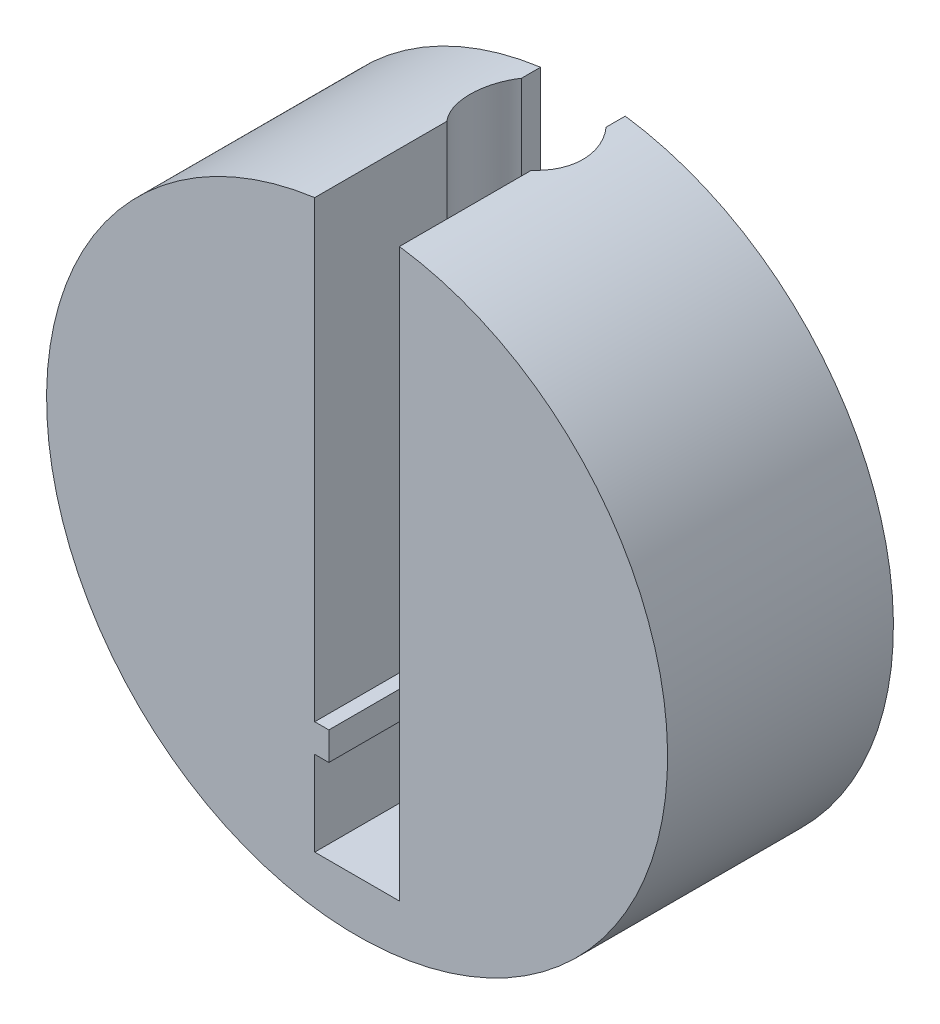
ISO-10303-21;
HEADER;
FILE_DESCRIPTION(('STEP AP214'),'2;1');
FILE_NAME('part.step','',(''),(''),'','','');
FILE_SCHEMA(('AUTOMOTIVE_DESIGN { 1 0 10303 214 1 1 1 1 }'));
ENDSEC;
DATA;
#1=APPLICATION_CONTEXT('core data for automotive mechanical design processes');
#2=APPLICATION_PROTOCOL_DEFINITION('international standard','automotive_design',2000,#1);
#3=PRODUCT_CONTEXT('',#1,'mechanical');
#4=PRODUCT('Part','Part','',(#3));
#5=PRODUCT_RELATED_PRODUCT_CATEGORY('part','',(#4));
#6=PRODUCT_DEFINITION_FORMATION('','',#4);
#7=PRODUCT_DEFINITION_CONTEXT('part definition',#1,'design');
#8=PRODUCT_DEFINITION('design','',#6,#7);
#9=PRODUCT_DEFINITION_SHAPE('','',#8);
#10=(LENGTH_UNIT() NAMED_UNIT(*) SI_UNIT(.MILLI.,.METRE.));
#11=(NAMED_UNIT(*) PLANE_ANGLE_UNIT() SI_UNIT($,.RADIAN.));
#12=(NAMED_UNIT(*) SI_UNIT($,.STERADIAN.) SOLID_ANGLE_UNIT());
#13=UNCERTAINTY_MEASURE_WITH_UNIT(LENGTH_MEASURE(1.E-05),#10,'distance_accuracy_value','');
#14=(GEOMETRIC_REPRESENTATION_CONTEXT(3) GLOBAL_UNCERTAINTY_ASSIGNED_CONTEXT((#13)) GLOBAL_UNIT_ASSIGNED_CONTEXT((#10,
#11,#12)) REPRESENTATION_CONTEXT('',''));
#15=CARTESIAN_POINT('',(0.,0.,0.));
#16=DIRECTION('',(0.,0.,1.));
#17=DIRECTION('',(1.,0.,0.));
#18=AXIS2_PLACEMENT_3D('',#15,#16,#17);
#19=CARTESIAN_POINT('',(0.,0.,0.));
#20=DIRECTION('',(0.,0.,1.));
#21=DIRECTION('',(1.,0.,0.));
#22=AXIS2_PLACEMENT_3D('',#19,#20,#21);
#23=PLANE('',#22);
#24=DIRECTION('',(0.,-1.,0.));
#25=VECTOR('',#24,1.);
#26=CARTESIAN_POINT('',(-6.,0.,0.));
#27=LINE('',#26,#25);
#28=CARTESIAN_POINT('',(-6.,1.5,0.));
#29=VERTEX_POINT('',#28);
#30=CARTESIAN_POINT('',(-6.,-1.5,0.));
#31=VERTEX_POINT('',#30);
#32=EDGE_CURVE('E72',#29,#31,#27,.T.);
#33=ORIENTED_EDGE('',*,*,#32,.T.);
#34=DIRECTION('',(-1.,0.,0.));
#35=VECTOR('',#34,1.);
#36=CARTESIAN_POINT('',(0.,-1.5,0.));
#37=LINE('',#36,#35);
#38=CARTESIAN_POINT('',(-4.,-1.5,0.));
#39=VERTEX_POINT('',#38);
#40=EDGE_CURVE('E242',#39,#31,#37,.T.);
#41=ORIENTED_EDGE('',*,*,#40,.F.);
#42=DIRECTION('',(0.,-1.,0.));
#43=VECTOR('',#42,1.);
#44=CARTESIAN_POINT('',(-4.,0.,0.));
#45=LINE('',#44,#43);
#46=CARTESIAN_POINT('',(-4.,1.5,0.));
#47=VERTEX_POINT('',#46);
#48=EDGE_CURVE('E260',#47,#39,#45,.T.);
#49=ORIENTED_EDGE('',*,*,#48,.F.);
#50=DIRECTION('',(-1.,0.,0.));
#51=VECTOR('',#50,1.);
#52=CARTESIAN_POINT('',(0.,1.5,0.));
#53=LINE('',#52,#51);
#54=EDGE_CURVE('E256',#47,#29,#53,.T.);
#55=ORIENTED_EDGE('',*,*,#54,.T.);
#56=EDGE_LOOP('',(#33,#41,#49,#55));
#57=FACE_BOUND('',#56,.T.);
#58=CARTESIAN_POINT('',(0.,0.,0.));
#59=DIRECTION('',(0.,0.,1.));
#60=DIRECTION('',(1.,0.,0.));
#61=AXIS2_PLACEMENT_3D('',#58,#59,#60);
#62=CIRCLE('',#61,11.);
#63=CARTESIAN_POINT('',(-1.5,10.8972473588517,0.));
#64=VERTEX_POINT('',#63);
#65=CARTESIAN_POINT('',(1.5,10.8972473588517,0.));
#66=VERTEX_POINT('',#65);
#67=EDGE_CURVE('E319',#64,#66,#62,.T.);
#68=ORIENTED_EDGE('',*,*,#67,.F.);
#69=DIRECTION('',(0.,-1.,0.));
#70=VECTOR('',#69,1.);
#71=CARTESIAN_POINT('',(-1.5,0.,0.));
#72=LINE('',#71,#70);
#73=CARTESIAN_POINT('',(-1.5,-5.18334617360803,0.));
#74=VERTEX_POINT('',#73);
#75=EDGE_CURVE('E324',#64,#74,#72,.T.);
#76=ORIENTED_EDGE('',*,*,#75,.T.);
#77=DIRECTION('',(-1.,0.,0.));
#78=VECTOR('',#77,1.);
#79=CARTESIAN_POINT('',(0.,-5.18334617360803,0.));
#80=LINE('',#79,#78);
#81=CARTESIAN_POINT('',(-1.,-5.18334617360803,0.));
#82=VERTEX_POINT('',#81);
#83=EDGE_CURVE('E374',#82,#74,#80,.T.);
#84=ORIENTED_EDGE('',*,*,#83,.F.);
#85=DIRECTION('',(0.,-1.,0.));
#86=VECTOR('',#85,1.);
#87=CARTESIAN_POINT('',(-1.,0.,0.));
#88=LINE('',#87,#86);
#89=CARTESIAN_POINT('',(-1.,-6.18334617360803,0.));
#90=VERTEX_POINT('',#89);
#91=EDGE_CURVE('E370',#82,#90,#88,.T.);
#92=ORIENTED_EDGE('',*,*,#91,.T.);
#93=DIRECTION('',(-1.,0.,0.));
#94=VECTOR('',#93,1.);
#95=CARTESIAN_POINT('',(0.,-6.18334617360803,0.));
#96=LINE('',#95,#94);
#97=CARTESIAN_POINT('',(-1.5,-6.18334617360803,0.));
#98=VERTEX_POINT('',#97);
#99=EDGE_CURVE('E366',#90,#98,#96,.T.);
#100=ORIENTED_EDGE('',*,*,#99,.T.);
#101=DIRECTION('',(0.,-1.,0.));
#102=VECTOR('',#101,1.);
#103=CARTESIAN_POINT('',(-1.5,0.,0.));
#104=LINE('',#103,#102);
#105=CARTESIAN_POINT('',(-1.5,-9.18334617360804,0.));
#106=VERTEX_POINT('',#105);
#107=EDGE_CURVE('E362',#98,#106,#104,.T.);
#108=ORIENTED_EDGE('',*,*,#107,.T.);
#109=DIRECTION('',(-1.,0.,0.));
#110=VECTOR('',#109,1.);
#111=CARTESIAN_POINT('',(0.,-9.18334617360804,0.));
#112=LINE('',#111,#110);
#113=CARTESIAN_POINT('',(1.5,-9.18334617360804,0.));
#114=VERTEX_POINT('',#113);
#115=EDGE_CURVE('E358',#114,#106,#112,.T.);
#116=ORIENTED_EDGE('',*,*,#115,.F.);
#117=DIRECTION('',(0.,1.,0.));
#118=VECTOR('',#117,1.);
#119=CARTESIAN_POINT('',(1.5,0.,0.));
#120=LINE('',#119,#118);
#121=EDGE_CURVE('E354',#114,#66,#120,.T.);
#122=ORIENTED_EDGE('',*,*,#121,.T.);
#123=EDGE_LOOP('',(#68,#76,#84,#92,#100,#108,#116,#122));
#124=FACE_BOUND('',#123,.T.);
#125=DIRECTION('',(0.,-1.,0.));
#126=VECTOR('',#125,1.);
#127=CARTESIAN_POINT('',(4.,0.,0.));
#128=LINE('',#127,#126);
#129=CARTESIAN_POINT('',(4.,1.5,0.));
#130=VERTEX_POINT('',#129);
#131=CARTESIAN_POINT('',(4.,-1.5,0.));
#132=VERTEX_POINT('',#131);
#133=EDGE_CURVE('E64',#130,#132,#128,.T.);
#134=ORIENTED_EDGE('',*,*,#133,.T.);
#135=DIRECTION('',(-1.,0.,0.));
#136=VECTOR('',#135,1.);
#137=CARTESIAN_POINT('',(0.,-1.5,0.));
#138=LINE('',#137,#136);
#139=CARTESIAN_POINT('',(6.,-1.5,0.));
#140=VERTEX_POINT('',#139);
#141=EDGE_CURVE('E209',#140,#132,#138,.T.);
#142=ORIENTED_EDGE('',*,*,#141,.F.);
#143=DIRECTION('',(0.,-1.,0.));
#144=VECTOR('',#143,1.);
#145=CARTESIAN_POINT('',(6.,0.,0.));
#146=LINE('',#145,#144);
#147=CARTESIAN_POINT('',(6.,1.5,0.));
#148=VERTEX_POINT('',#147);
#149=EDGE_CURVE('E213',#148,#140,#146,.T.);
#150=ORIENTED_EDGE('',*,*,#149,.F.);
#151=DIRECTION('',(-1.,0.,0.));
#152=VECTOR('',#151,1.);
#153=CARTESIAN_POINT('',(0.,1.5,0.));
#154=LINE('',#153,#152);
#155=EDGE_CURVE('E222',#148,#130,#154,.T.);
#156=ORIENTED_EDGE('',*,*,#155,.T.);
#157=EDGE_LOOP('',(#134,#142,#150,#156));
#158=FACE_BOUND('',#157,.T.);
#159=ADVANCED_FACE('F47',(#57,#124,#158),#23,.F.);
#160=CARTESIAN_POINT('',(-1.5,0.,8.));
#161=DIRECTION('',(1.,0.,0.));
#162=DIRECTION('',(0.,1.,0.));
#163=AXIS2_PLACEMENT_3D('',#160,#161,#162);
#164=PLANE('',#163);
#165=DIRECTION('',(0.,1.,0.));
#166=VECTOR('',#165,1.);
#167=CARTESIAN_POINT('',(-1.5,-10.8402004231004,0.677124344467703));
#168=LINE('',#167,#166);
#169=CARTESIAN_POINT('',(-1.5,-5.18334617360803,0.677124344467703));
#170=VERTEX_POINT('',#169);
#171=CARTESIAN_POINT('',(-1.5,10.8972473588517,0.677124344467706));
#172=VERTEX_POINT('',#171);
#173=EDGE_CURVE('E11',#170,#172,#168,.T.);
#174=ORIENTED_EDGE('',*,*,#173,.F.);
#175=DIRECTION('',(0.,0.,-1.));
#176=VECTOR('',#175,1.);
#177=CARTESIAN_POINT('',(-1.5,-5.18334617360803,8.));
#178=LINE('',#177,#176);
#179=EDGE_CURVE('E385',#170,#74,#178,.T.);
#180=ORIENTED_EDGE('',*,*,#179,.T.);
#181=ORIENTED_EDGE('',*,*,#75,.F.);
#182=DIRECTION('',(0.,0.,-1.));
#183=VECTOR('',#182,1.);
#184=CARTESIAN_POINT('',(-1.5,10.8972473588517,8.));
#185=LINE('',#184,#183);
#186=EDGE_CURVE('E350',#172,#64,#185,.T.);
#187=ORIENTED_EDGE('',*,*,#186,.F.);
#188=EDGE_LOOP('',(#174,#180,#181,#187));
#189=FACE_BOUND('',#188,.T.);
#190=ADVANCED_FACE('F458',(#189),#164,.T.);
#191=CARTESIAN_POINT('',(0.,0.,8.));
#192=DIRECTION('',(0.,0.,-1.));
#193=DIRECTION('',(-1.,0.,0.));
#194=AXIS2_PLACEMENT_3D('',#191,#192,#193);
#195=CYLINDRICAL_SURFACE('',#194,11.);
#196=CARTESIAN_POINT('',(-1.5,10.8972473588517,8.));
#197=VERTEX_POINT('',#196);
#198=CARTESIAN_POINT('',(-1.5,10.8972473588517,3.32287565553229));
#199=VERTEX_POINT('',#198);
#200=EDGE_CURVE('E381',#197,#199,#185,.T.);
#201=ORIENTED_EDGE('',*,*,#200,.T.);
#202=CARTESIAN_POINT('',(-1.5,10.8972473588517,3.3228756555323));
#203=CARTESIAN_POINT('',(-1.53701861772254,10.8921514934435,3.28089896762534));
#204=CARTESIAN_POINT('',(-1.57226143876146,10.8871084820412,3.23738483089129));
#205=CARTESIAN_POINT('',(-1.63899046345247,10.8772628901011,3.14753890388644));
#206=CARTESIAN_POINT('',(-1.67047658487105,10.8724603148279,3.10120705196982));
#207=CARTESIAN_POINT('',(-1.75893301637365,10.8586245894512,2.95846567358484));
#208=CARTESIAN_POINT('',(-1.80997371628999,10.8501530721462,2.85822820624215));
#209=CARTESIAN_POINT('',(-1.89461458915759,10.8356954359207,2.6504220260708));
#210=CARTESIAN_POINT('',(-1.92819956916029,10.8297114830073,2.54284701866229));
#211=CARTESIAN_POINT('',(-1.97685370507122,10.8209365192575,2.3235010289637));
#212=CARTESIAN_POINT('',(-1.99193292737687,10.8181437725887,2.21173236198941));
#213=CARTESIAN_POINT('',(-2.00305435376004,10.8160901313085,1.98846267784748));
#214=CARTESIAN_POINT('',(-1.99930453179108,10.8167906516413,1.87697228643442));
#215=CARTESIAN_POINT('',(-1.97335776979043,10.8215538837663,1.65617202223558));
#216=CARTESIAN_POINT('',(-1.95115150195586,10.8256182956495,1.54686328065653));
#217=CARTESIAN_POINT('',(-1.88908342173475,10.8366206418772,1.33394246233666));
#218=CARTESIAN_POINT('',(-1.84927827241537,10.8435493494421,1.23031329301812));
#219=CARTESIAN_POINT('',(-1.75320852353389,10.8594939611773,1.03127105955871));
#220=CARTESIAN_POINT('',(-1.69696770265243,10.8685068461124,0.935846381723813));
#221=CARTESIAN_POINT('',(-1.61265722978756,10.8811660153275,0.816516494758388));
#222=CARTESIAN_POINT('',(-1.59115461356048,10.88433426118,0.787762956575687));
#223=CARTESIAN_POINT('',(-1.54667580691712,10.890743701024,0.73150725794301));
#224=CARTESIAN_POINT('',(-1.52370217281535,10.8939847624375,0.704003061383881));
#225=CARTESIAN_POINT('',(-1.50000000000003,10.8972473588517,0.677124344467681));
#226=B_SPLINE_CURVE_WITH_KNOTS('',3,(#202,#203,#204,#205,#206,#207,#208,#209,#210,#211,#212,
#213,#214,#215,#216,#217,#218,#219,#220,#221,#222,#223,#224,#225),.UNSPECIFIED.,.F.,.F.,(4,2,2,
2,2,2,2,2,2,2,2,4),(0.,0.168497016897195,0.336997721489503,0.673673527830665,1.01064187830271,
1.34742685001015,1.68050014092636,2.01374186798522,2.34591838366978,2.67761667475394,
2.78571169251968,2.8936237109044),.UNSPECIFIED.);
#227=EDGE_CURVE('E281',#199,#172,#226,.T.);
#228=ORIENTED_EDGE('',*,*,#227,.T.);
#229=ORIENTED_EDGE('',*,*,#186,.T.);
#230=ORIENTED_EDGE('',*,*,#67,.T.);
#231=DIRECTION('',(0.,0.,-1.));
#232=VECTOR('',#231,1.);
#233=CARTESIAN_POINT('',(1.5,10.8972473588517,8.));
#234=LINE('',#233,#232);
#235=CARTESIAN_POINT('',(1.5,10.8972473588517,0.677124344467706));
#236=VERTEX_POINT('',#235);
#237=EDGE_CURVE('E405',#236,#66,#234,.T.);
#238=ORIENTED_EDGE('',*,*,#237,.F.);
#239=CARTESIAN_POINT('',(1.5,10.8972473588517,0.677124344467707));
#240=CARTESIAN_POINT('',(1.53701861772255,10.8921514934435,0.719101032374665));
#241=CARTESIAN_POINT('',(1.57226143876146,10.8871084820412,0.762615169108712));
#242=CARTESIAN_POINT('',(1.63899046345248,10.8772628901011,0.852461096113568));
#243=CARTESIAN_POINT('',(1.67047658487106,10.8724603148279,0.898792948030188));
#244=CARTESIAN_POINT('',(1.75893301637365,10.8586245894512,1.04153432641517));
#245=CARTESIAN_POINT('',(1.80997371628999,10.8501530721462,1.14177179375786));
#246=CARTESIAN_POINT('',(1.89461458915759,10.8356954359207,1.3495779739292));
#247=CARTESIAN_POINT('',(1.92819956916029,10.8297114830073,1.45715298133772));
#248=CARTESIAN_POINT('',(1.97685370507122,10.8209365192575,1.67649897103631));
#249=CARTESIAN_POINT('',(1.99193292737688,10.8181437725887,1.7882676380106));
#250=CARTESIAN_POINT('',(2.00305435376004,10.8160901313085,2.01153732215253));
#251=CARTESIAN_POINT('',(1.99930453179108,10.8167906516413,2.12302771356559));
#252=CARTESIAN_POINT('',(1.97335776979043,10.8215538837663,2.34382797776443));
#253=CARTESIAN_POINT('',(1.95115150195586,10.8256182956495,2.45313671934347));
#254=CARTESIAN_POINT('',(1.88908342173475,10.8366206418772,2.66605753766334));
#255=CARTESIAN_POINT('',(1.84927827241537,10.8435493494421,2.76968670698189));
#256=CARTESIAN_POINT('',(1.75320852353388,10.8594939611773,2.96872894044129));
#257=CARTESIAN_POINT('',(1.69696770265243,10.8685068461124,3.06415361827619));
#258=CARTESIAN_POINT('',(1.61265722978756,10.8811660153275,3.18348350524162));
#259=CARTESIAN_POINT('',(1.59115461356048,10.88433426118,3.21223704342432));
#260=CARTESIAN_POINT('',(1.54667580691712,10.890743701024,3.26849274205699));
#261=CARTESIAN_POINT('',(1.52370217281535,10.8939847624375,3.29599693861612));
#262=CARTESIAN_POINT('',(1.50000000000003,10.8972473588517,3.32287565553231));
#263=B_SPLINE_CURVE_WITH_KNOTS('',3,(#239,#240,#241,#242,#243,#244,#245,#246,#247,#248,#249,
#250,#251,#252,#253,#254,#255,#256,#257,#258,#259,#260,#261,#262),.UNSPECIFIED.,.F.,.F.,(4,2,2,
2,2,2,2,2,2,2,2,4),(0.,0.168497016897195,0.336997721489503,0.673673527830665,1.01064187830271,
1.34742685001015,1.68050014092637,2.01374186798522,2.34591838366978,2.67761667475395,
2.78571169251968,2.89362371090439),.UNSPECIFIED.);
#264=CARTESIAN_POINT('',(1.5,10.8972473588517,3.32287565553229));
#265=VERTEX_POINT('',#264);
#266=EDGE_CURVE('E305',#236,#265,#263,.T.);
#267=ORIENTED_EDGE('',*,*,#266,.T.);
#268=CARTESIAN_POINT('',(1.5,10.8972473588517,8.));
#269=VERTEX_POINT('',#268);
#270=EDGE_CURVE('E406',#269,#265,#234,.T.);
#271=ORIENTED_EDGE('',*,*,#270,.F.);
#272=CARTESIAN_POINT('',(0.,0.,8.));
#273=DIRECTION('',(0.,0.,1.));
#274=DIRECTION('',(1.,0.,0.));
#275=AXIS2_PLACEMENT_3D('',#272,#273,#274);
#276=CIRCLE('',#275,11.);
#277=EDGE_CURVE('E320',#197,#269,#276,.T.);
#278=ORIENTED_EDGE('',*,*,#277,.F.);
#279=EDGE_LOOP('',(#201,#228,#229,#230,#238,#267,#271,#278));
#280=FACE_BOUND('',#279,.T.);
#281=ADVANCED_FACE('F49',(#280),#195,.T.);
#282=CARTESIAN_POINT('',(1.5,0.,8.));
#283=DIRECTION('',(-1.,0.,0.));
#284=DIRECTION('',(0.,-1.,0.));
#285=AXIS2_PLACEMENT_3D('',#282,#283,#284);
#286=PLANE('',#285);
#287=DIRECTION('',(0.,1.,0.));
#288=VECTOR('',#287,1.);
#289=CARTESIAN_POINT('',(1.5,-10.8402004231004,3.32287565553229));
#290=LINE('',#289,#288);
#291=CARTESIAN_POINT('',(1.5,-5.18334617360803,3.32287565553229));
#292=VERTEX_POINT('',#291);
#293=EDGE_CURVE('E313',#292,#265,#290,.T.);
#294=ORIENTED_EDGE('',*,*,#293,.F.);
#295=DIRECTION('',(0.,0.,1.));
#296=VECTOR('',#295,1.);
#297=CARTESIAN_POINT('',(1.5,-5.18334617360803,8.));
#298=LINE('',#297,#296);
#299=CARTESIAN_POINT('',(1.5,-5.18334617360803,0.677124344467706));
#300=VERTEX_POINT('',#299);
#301=EDGE_CURVE('E316',#300,#292,#298,.T.);
#302=ORIENTED_EDGE('',*,*,#301,.F.);
#303=DIRECTION('',(0.,1.,0.));
#304=VECTOR('',#303,1.);
#305=CARTESIAN_POINT('',(1.5,-10.8402004231004,0.677124344467706));
#306=LINE('',#305,#304);
#307=EDGE_CURVE('E290',#236,#300,#306,.F.);
#308=ORIENTED_EDGE('',*,*,#307,.F.);
#309=ORIENTED_EDGE('',*,*,#237,.T.);
#310=ORIENTED_EDGE('',*,*,#121,.F.);
#311=DIRECTION('',(0.,0.,-1.));
#312=VECTOR('',#311,1.);
#313=CARTESIAN_POINT('',(1.5,-9.18334617360804,8.));
#314=LINE('',#313,#312);
#315=CARTESIAN_POINT('',(1.5,-9.18334617360804,8.));
#316=VERTEX_POINT('',#315);
#317=EDGE_CURVE('E402',#316,#114,#314,.T.);
#318=ORIENTED_EDGE('',*,*,#317,.F.);
#319=DIRECTION('',(0.,1.,0.));
#320=VECTOR('',#319,1.);
#321=CARTESIAN_POINT('',(1.5,0.,8.));
#322=LINE('',#321,#320);
#323=EDGE_CURVE('E323',#316,#269,#322,.T.);
#324=ORIENTED_EDGE('',*,*,#323,.T.);
#325=ORIENTED_EDGE('',*,*,#270,.T.);
#326=EDGE_LOOP('',(#294,#302,#308,#309,#310,#318,#324,#325));
#327=FACE_BOUND('',#326,.T.);
#328=ADVANCED_FACE('F452',(#327),#286,.T.);
#329=CARTESIAN_POINT('',(0.,-9.18334617360804,8.));
#330=DIRECTION('',(0.,-1.,0.));
#331=DIRECTION('',(0.,0.,-1.));
#332=AXIS2_PLACEMENT_3D('',#329,#330,#331);
#333=PLANE('',#332);
#334=ORIENTED_EDGE('',*,*,#115,.T.);
#335=DIRECTION('',(0.,0.,-1.));
#336=VECTOR('',#335,1.);
#337=CARTESIAN_POINT('',(-1.5,-9.18334617360804,8.));
#338=LINE('',#337,#336);
#339=CARTESIAN_POINT('',(-1.5,-9.18334617360804,8.));
#340=VERTEX_POINT('',#339);
#341=EDGE_CURVE('E399',#340,#106,#338,.T.);
#342=ORIENTED_EDGE('',*,*,#341,.F.);
#343=DIRECTION('',(-1.,0.,0.));
#344=VECTOR('',#343,1.);
#345=CARTESIAN_POINT('',(0.,-9.18334617360804,8.));
#346=LINE('',#345,#344);
#347=EDGE_CURVE('E328',#316,#340,#346,.T.);
#348=ORIENTED_EDGE('',*,*,#347,.F.);
#349=ORIENTED_EDGE('',*,*,#317,.T.);
#350=EDGE_LOOP('',(#334,#342,#348,#349));
#351=FACE_BOUND('',#350,.T.);
#352=ADVANCED_FACE('F449',(#351),#333,.F.);
#353=CARTESIAN_POINT('',(-1.5,0.,8.));
#354=DIRECTION('',(1.,0.,0.));
#355=DIRECTION('',(0.,1.,0.));
#356=AXIS2_PLACEMENT_3D('',#353,#354,#355);
#357=PLANE('',#356);
#358=ORIENTED_EDGE('',*,*,#107,.F.);
#359=DIRECTION('',(0.,0.,-1.));
#360=VECTOR('',#359,1.);
#361=CARTESIAN_POINT('',(-1.5,-6.18334617360803,8.));
#362=LINE('',#361,#360);
#363=CARTESIAN_POINT('',(-1.5,-6.18334617360803,8.));
#364=VERTEX_POINT('',#363);
#365=EDGE_CURVE('E396',#364,#98,#362,.T.);
#366=ORIENTED_EDGE('',*,*,#365,.F.);
#367=DIRECTION('',(0.,-1.,0.));
#368=VECTOR('',#367,1.);
#369=CARTESIAN_POINT('',(-1.5,0.,8.));
#370=LINE('',#369,#368);
#371=EDGE_CURVE('E331',#364,#340,#370,.T.);
#372=ORIENTED_EDGE('',*,*,#371,.T.);
#373=ORIENTED_EDGE('',*,*,#341,.T.);
#374=EDGE_LOOP('',(#358,#366,#372,#373));
#375=FACE_BOUND('',#374,.T.);
#376=ADVANCED_FACE('F444',(#375),#357,.T.);
#377=CARTESIAN_POINT('',(0.,-6.18334617360803,8.));
#378=DIRECTION('',(0.,-1.,0.));
#379=DIRECTION('',(1.,0.,0.));
#380=AXIS2_PLACEMENT_3D('',#377,#378,#379);
#381=PLANE('',#380);
#382=ORIENTED_EDGE('',*,*,#99,.F.);
#383=DIRECTION('',(0.,0.,-1.));
#384=VECTOR('',#383,1.);
#385=CARTESIAN_POINT('',(-1.,-6.18334617360803,8.));
#386=LINE('',#385,#384);
#387=CARTESIAN_POINT('',(-1.,-6.18334617360803,8.));
#388=VERTEX_POINT('',#387);
#389=EDGE_CURVE('E393',#388,#90,#386,.T.);
#390=ORIENTED_EDGE('',*,*,#389,.F.);
#391=DIRECTION('',(-1.,0.,0.));
#392=VECTOR('',#391,1.);
#393=CARTESIAN_POINT('',(0.,-6.18334617360803,8.));
#394=LINE('',#393,#392);
#395=EDGE_CURVE('E335',#388,#364,#394,.T.);
#396=ORIENTED_EDGE('',*,*,#395,.T.);
#397=ORIENTED_EDGE('',*,*,#365,.T.);
#398=EDGE_LOOP('',(#382,#390,#396,#397));
#399=FACE_BOUND('',#398,.T.);
#400=ADVANCED_FACE('F439',(#399),#381,.T.);
#401=CARTESIAN_POINT('',(-1.,0.,8.));
#402=DIRECTION('',(1.,0.,0.));
#403=DIRECTION('',(0.,1.,0.));
#404=AXIS2_PLACEMENT_3D('',#401,#402,#403);
#405=PLANE('',#404);
#406=ORIENTED_EDGE('',*,*,#91,.F.);
#407=DIRECTION('',(0.,0.,-1.));
#408=VECTOR('',#407,1.);
#409=CARTESIAN_POINT('',(-1.,-5.18334617360803,8.));
#410=LINE('',#409,#408);
#411=CARTESIAN_POINT('',(-1.,-5.18334617360803,8.));
#412=VERTEX_POINT('',#411);
#413=EDGE_CURVE('E390',#412,#82,#410,.T.);
#414=ORIENTED_EDGE('',*,*,#413,.F.);
#415=DIRECTION('',(0.,-1.,0.));
#416=VECTOR('',#415,1.);
#417=CARTESIAN_POINT('',(-1.,0.,8.));
#418=LINE('',#417,#416);
#419=EDGE_CURVE('E339',#412,#388,#418,.T.);
#420=ORIENTED_EDGE('',*,*,#419,.T.);
#421=ORIENTED_EDGE('',*,*,#389,.T.);
#422=EDGE_LOOP('',(#406,#414,#420,#421));
#423=FACE_BOUND('',#422,.T.);
#424=ADVANCED_FACE('F436',(#423),#405,.T.);
#425=CARTESIAN_POINT('',(0.,-5.18334617360803,8.));
#426=DIRECTION('',(0.,-1.,0.));
#427=DIRECTION('',(0.,0.,-1.));
#428=AXIS2_PLACEMENT_3D('',#425,#426,#427);
#429=PLANE('',#428);
#430=ORIENTED_EDGE('',*,*,#179,.F.);
#431=CARTESIAN_POINT('',(0.,-5.18334617360803,2.));
#432=DIRECTION('',(0.,-1.,0.));
#433=DIRECTION('',(0.,0.,-1.));
#434=AXIS2_PLACEMENT_3D('',#431,#432,#433);
#435=CIRCLE('',#434,2.);
#436=CARTESIAN_POINT('',(-1.5,-5.18334617360803,3.3228756555323));
#437=VERTEX_POINT('',#436);
#438=EDGE_CURVE('E280',#170,#437,#435,.F.);
#439=ORIENTED_EDGE('',*,*,#438,.T.);
#440=CARTESIAN_POINT('',(-1.5,-5.18334617360803,8.));
#441=VERTEX_POINT('',#440);
#442=EDGE_CURVE('E386',#441,#437,#178,.T.);
#443=ORIENTED_EDGE('',*,*,#442,.F.);
#444=DIRECTION('',(-1.,0.,0.));
#445=VECTOR('',#444,1.);
#446=CARTESIAN_POINT('',(0.,-5.18334617360803,8.));
#447=LINE('',#446,#445);
#448=EDGE_CURVE('E343',#412,#441,#447,.T.);
#449=ORIENTED_EDGE('',*,*,#448,.F.);
#450=ORIENTED_EDGE('',*,*,#413,.T.);
#451=ORIENTED_EDGE('',*,*,#83,.T.);
#452=EDGE_LOOP('',(#430,#439,#443,#449,#450,#451));
#453=FACE_BOUND('',#452,.T.);
#454=ADVANCED_FACE('F418',(#453),#429,.F.);
#455=DIRECTION('',(0.,1.,0.));
#456=VECTOR('',#455,1.);
#457=CARTESIAN_POINT('',(-1.5,-10.8402004231004,3.3228756555323));
#458=LINE('',#457,#456);
#459=EDGE_CURVE('E57',#199,#437,#458,.F.);
#460=ORIENTED_EDGE('',*,*,#459,.F.);
#461=ORIENTED_EDGE('',*,*,#200,.F.);
#462=DIRECTION('',(0.,-1.,0.));
#463=VECTOR('',#462,1.);
#464=CARTESIAN_POINT('',(-1.5,0.,8.));
#465=LINE('',#464,#463);
#466=EDGE_CURVE('E346',#197,#441,#465,.T.);
#467=ORIENTED_EDGE('',*,*,#466,.T.);
#468=ORIENTED_EDGE('',*,*,#442,.T.);
#469=EDGE_LOOP('',(#460,#461,#467,#468));
#470=FACE_BOUND('',#469,.T.);
#471=ADVANCED_FACE('F421',(#470),#164,.T.);
#472=CARTESIAN_POINT('',(0.,0.,8.));
#473=DIRECTION('',(0.,0.,1.));
#474=DIRECTION('',(1.,0.,0.));
#475=AXIS2_PLACEMENT_3D('',#472,#473,#474);
#476=PLANE('',#475);
#477=ORIENTED_EDGE('',*,*,#277,.T.);
#478=ORIENTED_EDGE('',*,*,#323,.F.);
#479=ORIENTED_EDGE('',*,*,#347,.T.);
#480=ORIENTED_EDGE('',*,*,#371,.F.);
#481=ORIENTED_EDGE('',*,*,#395,.F.);
#482=ORIENTED_EDGE('',*,*,#419,.F.);
#483=ORIENTED_EDGE('',*,*,#448,.T.);
#484=ORIENTED_EDGE('',*,*,#466,.F.);
#485=EDGE_LOOP('',(#477,#478,#479,#480,#481,#482,#483,#484));
#486=FACE_BOUND('',#485,.T.);
#487=ADVANCED_FACE('F302',(#486),#476,.T.);
#488=CARTESIAN_POINT('',(0.,-10.8402004231004,2.));
#489=DIRECTION('',(0.,1.,0.));
#490=DIRECTION('',(0.,0.,1.));
#491=AXIS2_PLACEMENT_3D('',#488,#489,#490);
#492=CYLINDRICAL_SURFACE('',#491,2.);
#493=ORIENTED_EDGE('',*,*,#173,.T.);
#494=ORIENTED_EDGE('',*,*,#227,.F.);
#495=ORIENTED_EDGE('',*,*,#459,.T.);
#496=ORIENTED_EDGE('',*,*,#438,.F.);
#497=EDGE_LOOP('',(#493,#494,#495,#496));
#498=FACE_BOUND('',#497,.T.);
#499=ADVANCED_FACE('F300',(#498),#492,.F.);
#500=ORIENTED_EDGE('',*,*,#301,.T.);
#501=EDGE_CURVE('E232',#292,#300,#435,.F.);
#502=ORIENTED_EDGE('',*,*,#501,.T.);
#503=EDGE_LOOP('',(#500,#502));
#504=FACE_BOUND('',#503,.T.);
#505=ADVANCED_FACE('F298',(#504),#429,.F.);
#506=ORIENTED_EDGE('',*,*,#293,.T.);
#507=ORIENTED_EDGE('',*,*,#266,.F.);
#508=ORIENTED_EDGE('',*,*,#307,.T.);
#509=ORIENTED_EDGE('',*,*,#501,.F.);
#510=EDGE_LOOP('',(#506,#507,#508,#509));
#511=FACE_BOUND('',#510,.T.);
#512=ADVANCED_FACE('F292',(#511),#492,.F.);
#513=CARTESIAN_POINT('',(-6.,0.,2.));
#514=DIRECTION('',(1.,0.,0.));
#515=DIRECTION('',(0.,0.,-1.));
#516=AXIS2_PLACEMENT_3D('',#513,#514,#515);
#517=PLANE('',#516);
#518=ORIENTED_EDGE('',*,*,#32,.F.);
#519=DIRECTION('',(0.,0.,-1.));
#520=VECTOR('',#519,1.);
#521=CARTESIAN_POINT('',(-6.,1.5,2.));
#522=LINE('',#521,#520);
#523=CARTESIAN_POINT('',(-6.,1.5,2.));
#524=VERTEX_POINT('',#523);
#525=EDGE_CURVE('E253',#524,#29,#522,.T.);
#526=ORIENTED_EDGE('',*,*,#525,.F.);
#527=DIRECTION('',(0.,-1.,0.));
#528=VECTOR('',#527,1.);
#529=CARTESIAN_POINT('',(-6.,0.,2.));
#530=LINE('',#529,#528);
#531=CARTESIAN_POINT('',(-6.,-1.5,2.));
#532=VERTEX_POINT('',#531);
#533=EDGE_CURVE('E238',#524,#532,#530,.T.);
#534=ORIENTED_EDGE('',*,*,#533,.T.);
#535=DIRECTION('',(0.,0.,-1.));
#536=VECTOR('',#535,1.);
#537=CARTESIAN_POINT('',(-6.,-1.5,2.));
#538=LINE('',#537,#536);
#539=EDGE_CURVE('E223',#532,#31,#538,.T.);
#540=ORIENTED_EDGE('',*,*,#539,.T.);
#541=EDGE_LOOP('',(#518,#526,#534,#540));
#542=FACE_BOUND('',#541,.T.);
#543=ADVANCED_FACE('F297',(#542),#517,.T.);
#544=CARTESIAN_POINT('',(0.,-1.5,2.));
#545=DIRECTION('',(0.,-1.,0.));
#546=DIRECTION('',(0.,0.,-1.));
#547=AXIS2_PLACEMENT_3D('',#544,#545,#546);
#548=PLANE('',#547);
#549=ORIENTED_EDGE('',*,*,#40,.T.);
#550=ORIENTED_EDGE('',*,*,#539,.F.);
#551=DIRECTION('',(-1.,0.,0.));
#552=VECTOR('',#551,1.);
#553=CARTESIAN_POINT('',(0.,-1.5,2.));
#554=LINE('',#553,#552);
#555=CARTESIAN_POINT('',(-4.,-1.5,2.));
#556=VERTEX_POINT('',#555);
#557=EDGE_CURVE('E249',#556,#532,#554,.T.);
#558=ORIENTED_EDGE('',*,*,#557,.F.);
#559=DIRECTION('',(0.,0.,-1.));
#560=VECTOR('',#559,1.);
#561=CARTESIAN_POINT('',(-4.,-1.5,2.));
#562=LINE('',#561,#560);
#563=EDGE_CURVE('E269',#556,#39,#562,.T.);
#564=ORIENTED_EDGE('',*,*,#563,.T.);
#565=EDGE_LOOP('',(#549,#550,#558,#564));
#566=FACE_BOUND('',#565,.T.);
#567=ADVANCED_FACE('F549',(#566),#548,.F.);
#568=CARTESIAN_POINT('',(-4.,0.,2.));
#569=DIRECTION('',(1.,0.,0.));
#570=DIRECTION('',(0.,0.,-1.));
#571=AXIS2_PLACEMENT_3D('',#568,#569,#570);
#572=PLANE('',#571);
#573=ORIENTED_EDGE('',*,*,#48,.T.);
#574=ORIENTED_EDGE('',*,*,#563,.F.);
#575=DIRECTION('',(0.,-1.,0.));
#576=VECTOR('',#575,1.);
#577=CARTESIAN_POINT('',(-4.,0.,2.));
#578=LINE('',#577,#576);
#579=CARTESIAN_POINT('',(-4.,1.5,2.));
#580=VERTEX_POINT('',#579);
#581=EDGE_CURVE('E245',#580,#556,#578,.T.);
#582=ORIENTED_EDGE('',*,*,#581,.F.);
#583=DIRECTION('',(0.,0.,-1.));
#584=VECTOR('',#583,1.);
#585=CARTESIAN_POINT('',(-4.,1.5,2.));
#586=LINE('',#585,#584);
#587=EDGE_CURVE('E272',#580,#47,#586,.T.);
#588=ORIENTED_EDGE('',*,*,#587,.T.);
#589=EDGE_LOOP('',(#573,#574,#582,#588));
#590=FACE_BOUND('',#589,.T.);
#591=ADVANCED_FACE('F556',(#590),#572,.F.);
#592=CARTESIAN_POINT('',(0.,1.5,2.));
#593=DIRECTION('',(0.,-1.,0.));
#594=DIRECTION('',(0.,0.,-1.));
#595=AXIS2_PLACEMENT_3D('',#592,#593,#594);
#596=PLANE('',#595);
#597=ORIENTED_EDGE('',*,*,#54,.F.);
#598=ORIENTED_EDGE('',*,*,#587,.F.);
#599=DIRECTION('',(-1.,0.,0.));
#600=VECTOR('',#599,1.);
#601=CARTESIAN_POINT('',(0.,1.5,2.));
#602=LINE('',#601,#600);
#603=EDGE_CURVE('E241',#580,#524,#602,.T.);
#604=ORIENTED_EDGE('',*,*,#603,.T.);
#605=ORIENTED_EDGE('',*,*,#525,.T.);
#606=EDGE_LOOP('',(#597,#598,#604,#605));
#607=FACE_BOUND('',#606,.T.);
#608=ADVANCED_FACE('F565',(#607),#596,.T.);
#609=CARTESIAN_POINT('',(0.,0.,2.));
#610=DIRECTION('',(0.,0.,-1.));
#611=DIRECTION('',(-1.,0.,0.));
#612=AXIS2_PLACEMENT_3D('',#609,#610,#611);
#613=PLANE('',#612);
#614=ORIENTED_EDGE('',*,*,#533,.F.);
#615=ORIENTED_EDGE('',*,*,#603,.F.);
#616=ORIENTED_EDGE('',*,*,#581,.T.);
#617=ORIENTED_EDGE('',*,*,#557,.T.);
#618=EDGE_LOOP('',(#614,#615,#616,#617));
#619=FACE_BOUND('',#618,.T.);
#620=ADVANCED_FACE('F574',(#619),#613,.T.);
#621=CARTESIAN_POINT('',(4.,0.,2.));
#622=DIRECTION('',(1.,0.,0.));
#623=DIRECTION('',(0.,0.,-1.));
#624=AXIS2_PLACEMENT_3D('',#621,#622,#623);
#625=PLANE('',#624);
#626=ORIENTED_EDGE('',*,*,#133,.F.);
#627=DIRECTION('',(0.,0.,-1.));
#628=VECTOR('',#627,1.);
#629=CARTESIAN_POINT('',(4.,1.5,2.));
#630=LINE('',#629,#628);
#631=CARTESIAN_POINT('',(4.,1.5,2.));
#632=VERTEX_POINT('',#631);
#633=EDGE_CURVE('E189',#632,#130,#630,.T.);
#634=ORIENTED_EDGE('',*,*,#633,.F.);
#635=DIRECTION('',(0.,-1.,0.));
#636=VECTOR('',#635,1.);
#637=CARTESIAN_POINT('',(4.,0.,2.));
#638=LINE('',#637,#636);
#639=CARTESIAN_POINT('',(4.,-1.5,2.));
#640=VERTEX_POINT('',#639);
#641=EDGE_CURVE('E198',#632,#640,#638,.T.);
#642=ORIENTED_EDGE('',*,*,#641,.T.);
#643=DIRECTION('',(0.,0.,-1.));
#644=VECTOR('',#643,1.);
#645=CARTESIAN_POINT('',(4.,-1.5,2.));
#646=LINE('',#645,#644);
#647=EDGE_CURVE('E229',#640,#132,#646,.T.);
#648=ORIENTED_EDGE('',*,*,#647,.T.);
#649=EDGE_LOOP('',(#626,#634,#642,#648));
#650=FACE_BOUND('',#649,.T.);
#651=ADVANCED_FACE('F200',(#650),#625,.T.);
#652=CARTESIAN_POINT('',(0.,-1.5,2.));
#653=DIRECTION('',(0.,-1.,0.));
#654=DIRECTION('',(0.,0.,-1.));
#655=AXIS2_PLACEMENT_3D('',#652,#653,#654);
#656=PLANE('',#655);
#657=ORIENTED_EDGE('',*,*,#141,.T.);
#658=ORIENTED_EDGE('',*,*,#647,.F.);
#659=DIRECTION('',(-1.,0.,0.));
#660=VECTOR('',#659,1.);
#661=CARTESIAN_POINT('',(0.,-1.5,2.));
#662=LINE('',#661,#660);
#663=CARTESIAN_POINT('',(6.,-1.5,2.));
#664=VERTEX_POINT('',#663);
#665=EDGE_CURVE('E203',#664,#640,#662,.T.);
#666=ORIENTED_EDGE('',*,*,#665,.F.);
#667=DIRECTION('',(0.,0.,-1.));
#668=VECTOR('',#667,1.);
#669=CARTESIAN_POINT('',(6.,-1.5,2.));
#670=LINE('',#669,#668);
#671=EDGE_CURVE('E233',#664,#140,#670,.T.);
#672=ORIENTED_EDGE('',*,*,#671,.T.);
#673=EDGE_LOOP('',(#657,#658,#666,#672));
#674=FACE_BOUND('',#673,.T.);
#675=ADVANCED_FACE('F590',(#674),#656,.F.);
#676=CARTESIAN_POINT('',(6.,0.,2.));
#677=DIRECTION('',(1.,0.,0.));
#678=DIRECTION('',(0.,0.,-1.));
#679=AXIS2_PLACEMENT_3D('',#676,#677,#678);
#680=PLANE('',#679);
#681=ORIENTED_EDGE('',*,*,#149,.T.);
#682=ORIENTED_EDGE('',*,*,#671,.F.);
#683=DIRECTION('',(0.,-1.,0.));
#684=VECTOR('',#683,1.);
#685=CARTESIAN_POINT('',(6.,0.,2.));
#686=LINE('',#685,#684);
#687=CARTESIAN_POINT('',(6.,1.5,2.));
#688=VERTEX_POINT('',#687);
#689=EDGE_CURVE('E197',#688,#664,#686,.T.);
#690=ORIENTED_EDGE('',*,*,#689,.F.);
#691=DIRECTION('',(0.,0.,-1.));
#692=VECTOR('',#691,1.);
#693=CARTESIAN_POINT('',(6.,1.5,2.));
#694=LINE('',#693,#692);
#695=EDGE_CURVE('E191',#688,#148,#694,.T.);
#696=ORIENTED_EDGE('',*,*,#695,.T.);
#697=EDGE_LOOP('',(#681,#682,#690,#696));
#698=FACE_BOUND('',#697,.T.);
#699=ADVANCED_FACE('F598',(#698),#680,.F.);
#700=CARTESIAN_POINT('',(0.,1.5,2.));
#701=DIRECTION('',(0.,-1.,0.));
#702=DIRECTION('',(0.,0.,-1.));
#703=AXIS2_PLACEMENT_3D('',#700,#701,#702);
#704=PLANE('',#703);
#705=ORIENTED_EDGE('',*,*,#155,.F.);
#706=ORIENTED_EDGE('',*,*,#695,.F.);
#707=DIRECTION('',(-1.,0.,0.));
#708=VECTOR('',#707,1.);
#709=CARTESIAN_POINT('',(0.,1.5,2.));
#710=LINE('',#709,#708);
#711=EDGE_CURVE('E186',#688,#632,#710,.T.);
#712=ORIENTED_EDGE('',*,*,#711,.T.);
#713=ORIENTED_EDGE('',*,*,#633,.T.);
#714=EDGE_LOOP('',(#705,#706,#712,#713));
#715=FACE_BOUND('',#714,.T.);
#716=ADVANCED_FACE('F188',(#715),#704,.T.);
#717=CARTESIAN_POINT('',(0.,0.,2.));
#718=DIRECTION('',(0.,0.,-1.));
#719=DIRECTION('',(-1.,0.,0.));
#720=AXIS2_PLACEMENT_3D('',#717,#718,#719);
#721=PLANE('',#720);
#722=ORIENTED_EDGE('',*,*,#641,.F.);
#723=ORIENTED_EDGE('',*,*,#711,.F.);
#724=ORIENTED_EDGE('',*,*,#689,.T.);
#725=ORIENTED_EDGE('',*,*,#665,.T.);
#726=EDGE_LOOP('',(#722,#723,#724,#725));
#727=FACE_BOUND('',#726,.T.);
#728=ADVANCED_FACE('F206',(#727),#721,.T.);
#729=CLOSED_SHELL('',(#159,#190,#281,#328,#352,#376,#400,#424,#454,#471,#487,#499,#505,#512,
#543,#567,#591,#608,#620,#651,#675,#699,#716,#728));
#730=MANIFOLD_SOLID_BREP('B2',#729);
#731=ADVANCED_BREP_SHAPE_REPRESENTATION('',(#18,#730),#14);
#732=SHAPE_DEFINITION_REPRESENTATION(#9,#731);
ENDSEC;
END-ISO-10303-21;
